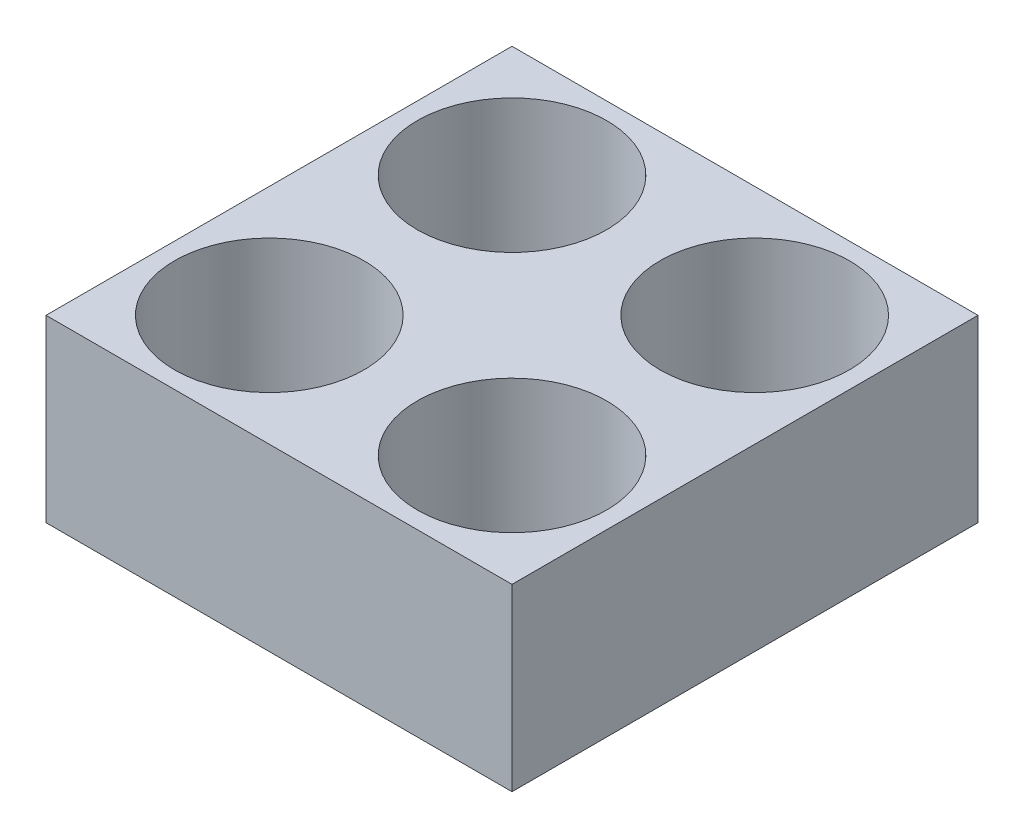
ISO-10303-21;
HEADER;
FILE_DESCRIPTION(('STEP AP214'),'2;1');
FILE_NAME('part.step','',(''),(''),'','','');
FILE_SCHEMA(('AUTOMOTIVE_DESIGN { 1 0 10303 214 1 1 1 1 }'));
ENDSEC;
DATA;
#1=APPLICATION_CONTEXT('core data for automotive mechanical design processes');
#2=APPLICATION_PROTOCOL_DEFINITION('international standard','automotive_design',2000,#1);
#3=PRODUCT_CONTEXT('',#1,'mechanical');
#4=PRODUCT('Part','Part','',(#3));
#5=PRODUCT_RELATED_PRODUCT_CATEGORY('part','',(#4));
#6=PRODUCT_DEFINITION_FORMATION('','',#4);
#7=PRODUCT_DEFINITION_CONTEXT('part definition',#1,'design');
#8=PRODUCT_DEFINITION('design','',#6,#7);
#9=PRODUCT_DEFINITION_SHAPE('','',#8);
#10=(LENGTH_UNIT() NAMED_UNIT(*) SI_UNIT(.MILLI.,.METRE.));
#11=(NAMED_UNIT(*) PLANE_ANGLE_UNIT() SI_UNIT($,.RADIAN.));
#12=(NAMED_UNIT(*) SI_UNIT($,.STERADIAN.) SOLID_ANGLE_UNIT());
#13=UNCERTAINTY_MEASURE_WITH_UNIT(LENGTH_MEASURE(1.E-05),#10,'distance_accuracy_value','');
#14=(GEOMETRIC_REPRESENTATION_CONTEXT(3) GLOBAL_UNCERTAINTY_ASSIGNED_CONTEXT((#13)) GLOBAL_UNIT_ASSIGNED_CONTEXT((#10,
#11,#12)) REPRESENTATION_CONTEXT('',''));
#15=CARTESIAN_POINT('',(0.,0.,0.));
#16=DIRECTION('',(0.,0.,1.));
#17=DIRECTION('',(1.,0.,0.));
#18=AXIS2_PLACEMENT_3D('',#15,#16,#17);
#19=CARTESIAN_POINT('',(0.,35.,0.));
#20=DIRECTION('',(0.,-1.,0.));
#21=DIRECTION('',(0.,0.,-1.));
#22=AXIS2_PLACEMENT_3D('',#19,#20,#21);
#23=PLANE('',#22);
#24=DIRECTION('',(0.,0.,-1.));
#25=VECTOR('',#24,1.);
#26=CARTESIAN_POINT('',(72.9999999999998,35.,23.));
#27=LINE('',#26,#25);
#28=CARTESIAN_POINT('',(72.9999999999998,35.,23.));
#29=VERTEX_POINT('',#28);
#30=CARTESIAN_POINT('',(72.9999999999998,35.,-73.));
#31=VERTEX_POINT('',#30);
#32=EDGE_CURVE('E124',#29,#31,#27,.T.);
#33=ORIENTED_EDGE('',*,*,#32,.T.);
#34=DIRECTION('',(-1.,0.,0.));
#35=VECTOR('',#34,1.);
#36=CARTESIAN_POINT('',(-23.0000000000002,35.,-73.));
#37=LINE('',#36,#35);
#38=CARTESIAN_POINT('',(-23.0000000000002,35.,-73.));
#39=VERTEX_POINT('',#38);
#40=EDGE_CURVE('E78',#31,#39,#37,.T.);
#41=ORIENTED_EDGE('',*,*,#40,.T.);
#42=DIRECTION('',(0.,0.,1.));
#43=VECTOR('',#42,1.);
#44=CARTESIAN_POINT('',(-23.0000000000002,35.,23.));
#45=LINE('',#44,#43);
#46=CARTESIAN_POINT('',(-23.0000000000002,35.,23.));
#47=VERTEX_POINT('',#46);
#48=EDGE_CURVE('E53',#39,#47,#45,.T.);
#49=ORIENTED_EDGE('',*,*,#48,.T.);
#50=DIRECTION('',(1.,0.,0.));
#51=VECTOR('',#50,1.);
#52=CARTESIAN_POINT('',(-23.0000000000002,35.,23.));
#53=LINE('',#52,#51);
#54=EDGE_CURVE('E48',#47,#29,#53,.T.);
#55=ORIENTED_EDGE('',*,*,#54,.T.);
#56=EDGE_LOOP('',(#33,#41,#49,#55));
#57=FACE_BOUND('',#56,.T.);
#58=CARTESIAN_POINT('',(0.,35.,0.));
#59=DIRECTION('',(0.,1.,0.));
#60=DIRECTION('',(0.,0.,1.));
#61=AXIS2_PLACEMENT_3D('',#58,#59,#60);
#62=CIRCLE('',#61,19.5);
#63=CARTESIAN_POINT('',(0.,35.,19.5));
#64=VERTEX_POINT('',#63);
#65=EDGE_CURVE('E121',#64,#64,#62,.T.);
#66=ORIENTED_EDGE('',*,*,#65,.F.);
#67=EDGE_LOOP('',(#66));
#68=FACE_BOUND('',#67,.T.);
#69=CARTESIAN_POINT('',(50.,35.,0.));
#70=DIRECTION('',(0.,1.,0.));
#71=DIRECTION('',(0.,0.,1.));
#72=AXIS2_PLACEMENT_3D('',#69,#70,#71);
#73=CIRCLE('',#72,19.5);
#74=CARTESIAN_POINT('',(50.,35.,19.5));
#75=VERTEX_POINT('',#74);
#76=EDGE_CURVE('E115',#75,#75,#73,.T.);
#77=ORIENTED_EDGE('',*,*,#76,.F.);
#78=EDGE_LOOP('',(#77));
#79=FACE_BOUND('',#78,.T.);
#80=CARTESIAN_POINT('',(49.9999999999998,35.,-50.));
#81=DIRECTION('',(0.,1.,0.));
#82=DIRECTION('',(0.,0.,1.));
#83=AXIS2_PLACEMENT_3D('',#80,#81,#82);
#84=CIRCLE('',#83,19.5);
#85=CARTESIAN_POINT('',(49.9999999999998,35.,-30.5));
#86=VERTEX_POINT('',#85);
#87=EDGE_CURVE('E109',#86,#86,#84,.T.);
#88=ORIENTED_EDGE('',*,*,#87,.F.);
#89=EDGE_LOOP('',(#88));
#90=FACE_BOUND('',#89,.T.);
#91=CARTESIAN_POINT('',(-1.74574066942157E-13,35.,-50.));
#92=DIRECTION('',(0.,1.,0.));
#93=DIRECTION('',(0.,0.,1.));
#94=AXIS2_PLACEMENT_3D('',#91,#92,#93);
#95=CIRCLE('',#94,19.5);
#96=CARTESIAN_POINT('',(-1.74574066942157E-13,35.,-30.5));
#97=VERTEX_POINT('',#96);
#98=EDGE_CURVE('E103',#97,#97,#95,.T.);
#99=ORIENTED_EDGE('',*,*,#98,.F.);
#100=EDGE_LOOP('',(#99));
#101=FACE_BOUND('',#100,.T.);
#102=ADVANCED_FACE('F33',(#57,#68,#79,#90,#101),#23,.F.);
#103=CARTESIAN_POINT('',(72.9999999999998,35.,23.));
#104=DIRECTION('',(-1.,0.,0.));
#105=DIRECTION('',(0.,0.,1.));
#106=AXIS2_PLACEMENT_3D('',#103,#104,#105);
#107=PLANE('',#106);
#108=DIRECTION('',(0.,-1.,0.));
#109=VECTOR('',#108,1.);
#110=CARTESIAN_POINT('',(72.9999999999998,35.,23.));
#111=LINE('',#110,#109);
#112=CARTESIAN_POINT('',(72.9999999999998,-2.,23.));
#113=VERTEX_POINT('',#112);
#114=EDGE_CURVE('E83',#29,#113,#111,.T.);
#115=ORIENTED_EDGE('',*,*,#114,.T.);
#116=DIRECTION('',(0.,0.,1.));
#117=VECTOR('',#116,1.);
#118=CARTESIAN_POINT('',(72.9999999999998,-2.,-73.));
#119=LINE('',#118,#117);
#120=CARTESIAN_POINT('',(72.9999999999998,-2.,-73.));
#121=VERTEX_POINT('',#120);
#122=EDGE_CURVE('E82',#121,#113,#119,.T.);
#123=ORIENTED_EDGE('',*,*,#122,.F.);
#124=DIRECTION('',(0.,-1.,0.));
#125=VECTOR('',#124,1.);
#126=CARTESIAN_POINT('',(72.9999999999998,35.,-73.));
#127=LINE('',#126,#125);
#128=EDGE_CURVE('E11',#31,#121,#127,.T.);
#129=ORIENTED_EDGE('',*,*,#128,.F.);
#130=ORIENTED_EDGE('',*,*,#32,.F.);
#131=EDGE_LOOP('',(#115,#123,#129,#130));
#132=FACE_BOUND('',#131,.T.);
#133=ADVANCED_FACE('F35',(#132),#107,.F.);
#134=CARTESIAN_POINT('',(-23.0000000000002,35.,-73.));
#135=DIRECTION('',(0.,0.,1.));
#136=DIRECTION('',(1.,0.,0.));
#137=AXIS2_PLACEMENT_3D('',#134,#135,#136);
#138=PLANE('',#137);
#139=ORIENTED_EDGE('',*,*,#128,.T.);
#140=DIRECTION('',(1.,0.,0.));
#141=VECTOR('',#140,1.);
#142=CARTESIAN_POINT('',(-23.0000000000002,-2.,-73.));
#143=LINE('',#142,#141);
#144=CARTESIAN_POINT('',(-23.0000000000002,-2.,-73.));
#145=VERTEX_POINT('',#144);
#146=EDGE_CURVE('E77',#145,#121,#143,.T.);
#147=ORIENTED_EDGE('',*,*,#146,.F.);
#148=DIRECTION('',(0.,-1.,0.));
#149=VECTOR('',#148,1.);
#150=CARTESIAN_POINT('',(-23.0000000000002,35.,-73.));
#151=LINE('',#150,#149);
#152=EDGE_CURVE('E41',#39,#145,#151,.T.);
#153=ORIENTED_EDGE('',*,*,#152,.F.);
#154=ORIENTED_EDGE('',*,*,#40,.F.);
#155=EDGE_LOOP('',(#139,#147,#153,#154));
#156=FACE_BOUND('',#155,.T.);
#157=ADVANCED_FACE('F74',(#156),#138,.F.);
#158=CARTESIAN_POINT('',(-23.0000000000002,35.,23.));
#159=DIRECTION('',(1.,0.,0.));
#160=DIRECTION('',(0.,0.,-1.));
#161=AXIS2_PLACEMENT_3D('',#158,#159,#160);
#162=PLANE('',#161);
#163=ORIENTED_EDGE('',*,*,#152,.T.);
#164=DIRECTION('',(0.,0.,-1.));
#165=VECTOR('',#164,1.);
#166=CARTESIAN_POINT('',(-23.0000000000002,-2.,23.));
#167=LINE('',#166,#165);
#168=CARTESIAN_POINT('',(-23.0000000000002,-2.,23.));
#169=VERTEX_POINT('',#168);
#170=EDGE_CURVE('E92',#169,#145,#167,.T.);
#171=ORIENTED_EDGE('',*,*,#170,.F.);
#172=DIRECTION('',(0.,-1.,0.));
#173=VECTOR('',#172,1.);
#174=CARTESIAN_POINT('',(-23.0000000000002,35.,23.));
#175=LINE('',#174,#173);
#176=EDGE_CURVE('E132',#47,#169,#175,.T.);
#177=ORIENTED_EDGE('',*,*,#176,.F.);
#178=ORIENTED_EDGE('',*,*,#48,.F.);
#179=EDGE_LOOP('',(#163,#171,#177,#178));
#180=FACE_BOUND('',#179,.T.);
#181=ADVANCED_FACE('F134',(#180),#162,.F.);
#182=CARTESIAN_POINT('',(-23.0000000000002,35.,23.));
#183=DIRECTION('',(0.,0.,-1.));
#184=DIRECTION('',(-1.,0.,0.));
#185=AXIS2_PLACEMENT_3D('',#182,#183,#184);
#186=PLANE('',#185);
#187=ORIENTED_EDGE('',*,*,#176,.T.);
#188=DIRECTION('',(-1.,0.,0.));
#189=VECTOR('',#188,1.);
#190=CARTESIAN_POINT('',(72.9999999999998,-2.,23.));
#191=LINE('',#190,#189);
#192=EDGE_CURVE('E87',#113,#169,#191,.T.);
#193=ORIENTED_EDGE('',*,*,#192,.F.);
#194=ORIENTED_EDGE('',*,*,#114,.F.);
#195=ORIENTED_EDGE('',*,*,#54,.F.);
#196=EDGE_LOOP('',(#187,#193,#194,#195));
#197=FACE_BOUND('',#196,.T.);
#198=ADVANCED_FACE('F136',(#197),#186,.F.);
#199=CARTESIAN_POINT('',(0.,35.,0.));
#200=DIRECTION('',(0.,-1.,0.));
#201=DIRECTION('',(0.,0.,-1.));
#202=AXIS2_PLACEMENT_3D('',#199,#200,#201);
#203=CYLINDRICAL_SURFACE('',#202,19.5);
#204=ORIENTED_EDGE('',*,*,#65,.T.);
#205=EDGE_LOOP('',(#204));
#206=FACE_BOUND('',#205,.T.);
#207=CARTESIAN_POINT('',(0.,0.,0.));
#208=DIRECTION('',(0.,1.,0.));
#209=DIRECTION('',(0.,0.,1.));
#210=AXIS2_PLACEMENT_3D('',#207,#208,#209);
#211=CIRCLE('',#210,19.5);
#212=CARTESIAN_POINT('',(0.,0.,19.5));
#213=VERTEX_POINT('',#212);
#214=EDGE_CURVE('E118',#213,#213,#211,.T.);
#215=ORIENTED_EDGE('',*,*,#214,.F.);
#216=EDGE_LOOP('',(#215));
#217=FACE_BOUND('',#216,.T.);
#218=ADVANCED_FACE('F196',(#206,#217),#203,.F.);
#219=CARTESIAN_POINT('',(50.,35.,0.));
#220=DIRECTION('',(0.,-1.,0.));
#221=DIRECTION('',(0.,0.,-1.));
#222=AXIS2_PLACEMENT_3D('',#219,#220,#221);
#223=CYLINDRICAL_SURFACE('',#222,19.5);
#224=ORIENTED_EDGE('',*,*,#76,.T.);
#225=EDGE_LOOP('',(#224));
#226=FACE_BOUND('',#225,.T.);
#227=CARTESIAN_POINT('',(50.,0.,0.));
#228=DIRECTION('',(0.,1.,0.));
#229=DIRECTION('',(0.,0.,1.));
#230=AXIS2_PLACEMENT_3D('',#227,#228,#229);
#231=CIRCLE('',#230,19.5);
#232=CARTESIAN_POINT('',(50.,0.,19.5));
#233=VERTEX_POINT('',#232);
#234=EDGE_CURVE('E112',#233,#233,#231,.T.);
#235=ORIENTED_EDGE('',*,*,#234,.F.);
#236=EDGE_LOOP('',(#235));
#237=FACE_BOUND('',#236,.T.);
#238=ADVANCED_FACE('F198',(#226,#237),#223,.F.);
#239=CARTESIAN_POINT('',(49.9999999999998,35.,-50.));
#240=DIRECTION('',(0.,-1.,0.));
#241=DIRECTION('',(0.,0.,-1.));
#242=AXIS2_PLACEMENT_3D('',#239,#240,#241);
#243=CYLINDRICAL_SURFACE('',#242,19.5);
#244=ORIENTED_EDGE('',*,*,#87,.T.);
#245=EDGE_LOOP('',(#244));
#246=FACE_BOUND('',#245,.T.);
#247=CARTESIAN_POINT('',(49.9999999999998,0.,-50.));
#248=DIRECTION('',(0.,1.,0.));
#249=DIRECTION('',(0.,0.,1.));
#250=AXIS2_PLACEMENT_3D('',#247,#248,#249);
#251=CIRCLE('',#250,19.5);
#252=CARTESIAN_POINT('',(49.9999999999998,0.,-30.5));
#253=VERTEX_POINT('',#252);
#254=EDGE_CURVE('E106',#253,#253,#251,.T.);
#255=ORIENTED_EDGE('',*,*,#254,.F.);
#256=EDGE_LOOP('',(#255));
#257=FACE_BOUND('',#256,.T.);
#258=ADVANCED_FACE('F152',(#246,#257),#243,.F.);
#259=CARTESIAN_POINT('',(-1.74574066942157E-13,35.,-50.));
#260=DIRECTION('',(0.,-1.,0.));
#261=DIRECTION('',(0.,0.,-1.));
#262=AXIS2_PLACEMENT_3D('',#259,#260,#261);
#263=CYLINDRICAL_SURFACE('',#262,19.5);
#264=ORIENTED_EDGE('',*,*,#98,.T.);
#265=EDGE_LOOP('',(#264));
#266=FACE_BOUND('',#265,.T.);
#267=CARTESIAN_POINT('',(-1.74574066942157E-13,0.,-50.));
#268=DIRECTION('',(0.,1.,0.));
#269=DIRECTION('',(0.,0.,1.));
#270=AXIS2_PLACEMENT_3D('',#267,#268,#269);
#271=CIRCLE('',#270,19.5);
#272=CARTESIAN_POINT('',(-1.74574066942157E-13,0.,-30.5));
#273=VERTEX_POINT('',#272);
#274=EDGE_CURVE('E102',#273,#273,#271,.T.);
#275=ORIENTED_EDGE('',*,*,#274,.F.);
#276=EDGE_LOOP('',(#275));
#277=FACE_BOUND('',#276,.T.);
#278=ADVANCED_FACE('F148',(#266,#277),#263,.F.);
#279=CARTESIAN_POINT('',(0.,0.,0.));
#280=DIRECTION('',(0.,-1.,0.));
#281=DIRECTION('',(0.,0.,-1.));
#282=AXIS2_PLACEMENT_3D('',#279,#280,#281);
#283=PLANE('',#282);
#284=CARTESIAN_POINT('',(7.,0.,-57.));
#285=DIRECTION('',(0.,1.,0.));
#286=DIRECTION('',(0.,0.,1.));
#287=AXIS2_PLACEMENT_3D('',#284,#285,#286);
#288=CIRCLE('',#287,3.6);
#289=CARTESIAN_POINT('',(7.,0.,-53.4));
#290=VERTEX_POINT('',#289);
#291=EDGE_CURVE('E525',#290,#290,#288,.T.);
#292=ORIENTED_EDGE('',*,*,#291,.F.);
#293=EDGE_LOOP('',(#292));
#294=FACE_BOUND('',#293,.T.);
#295=CARTESIAN_POINT('',(7.,0.,-43.));
#296=DIRECTION('',(0.,1.,0.));
#297=DIRECTION('',(0.,0.,-1.));
#298=AXIS2_PLACEMENT_3D('',#295,#296,#297);
#299=CIRCLE('',#298,3.6);
#300=CARTESIAN_POINT('',(7.,0.,-46.6));
#301=VERTEX_POINT('',#300);
#302=EDGE_CURVE('E531',#301,#301,#299,.T.);
#303=ORIENTED_EDGE('',*,*,#302,.F.);
#304=EDGE_LOOP('',(#303));
#305=FACE_BOUND('',#304,.T.);
#306=CARTESIAN_POINT('',(-7.,0.,-43.));
#307=DIRECTION('',(0.,1.,0.));
#308=DIRECTION('',(0.,0.,1.));
#309=AXIS2_PLACEMENT_3D('',#306,#307,#308);
#310=CIRCLE('',#309,3.6);
#311=CARTESIAN_POINT('',(-7.,0.,-39.4));
#312=VERTEX_POINT('',#311);
#313=EDGE_CURVE('E537',#312,#312,#310,.T.);
#314=ORIENTED_EDGE('',*,*,#313,.F.);
#315=EDGE_LOOP('',(#314));
#316=FACE_BOUND('',#315,.T.);
#317=CARTESIAN_POINT('',(-7.,0.,-57.));
#318=DIRECTION('',(0.,1.,0.));
#319=DIRECTION('',(0.,0.,-1.));
#320=AXIS2_PLACEMENT_3D('',#317,#318,#319);
#321=CIRCLE('',#320,3.6);
#322=CARTESIAN_POINT('',(-7.,0.,-60.6));
#323=VERTEX_POINT('',#322);
#324=EDGE_CURVE('E543',#323,#323,#321,.T.);
#325=ORIENTED_EDGE('',*,*,#324,.F.);
#326=EDGE_LOOP('',(#325));
#327=FACE_BOUND('',#326,.T.);
#328=ORIENTED_EDGE('',*,*,#274,.T.);
#329=EDGE_LOOP('',(#328));
#330=FACE_BOUND('',#329,.T.);
#331=ADVANCED_FACE('F151',(#294,#305,#316,#327,#330),#283,.F.);
#332=CARTESIAN_POINT('',(56.9999999999998,0.,-57.));
#333=DIRECTION('',(0.,1.,0.));
#334=DIRECTION('',(0.,0.,-1.));
#335=AXIS2_PLACEMENT_3D('',#332,#333,#334);
#336=CIRCLE('',#335,3.6);
#337=CARTESIAN_POINT('',(56.9999999999998,0.,-60.6));
#338=VERTEX_POINT('',#337);
#339=EDGE_CURVE('E466',#338,#338,#336,.T.);
#340=ORIENTED_EDGE('',*,*,#339,.F.);
#341=EDGE_LOOP('',(#340));
#342=FACE_BOUND('',#341,.T.);
#343=CARTESIAN_POINT('',(42.9999999999998,0.,-43.));
#344=DIRECTION('',(0.,1.,0.));
#345=DIRECTION('',(0.,0.,-1.));
#346=AXIS2_PLACEMENT_3D('',#343,#344,#345);
#347=CIRCLE('',#346,3.6);
#348=CARTESIAN_POINT('',(42.9999999999998,0.,-46.6));
#349=VERTEX_POINT('',#348);
#350=EDGE_CURVE('E471',#349,#349,#347,.T.);
#351=ORIENTED_EDGE('',*,*,#350,.F.);
#352=EDGE_LOOP('',(#351));
#353=FACE_BOUND('',#352,.T.);
#354=CARTESIAN_POINT('',(42.9999999999998,0.,-57.));
#355=DIRECTION('',(0.,1.,0.));
#356=DIRECTION('',(0.,0.,1.));
#357=AXIS2_PLACEMENT_3D('',#354,#355,#356);
#358=CIRCLE('',#357,3.6);
#359=CARTESIAN_POINT('',(42.9999999999998,0.,-53.4));
#360=VERTEX_POINT('',#359);
#361=EDGE_CURVE('E479',#360,#360,#358,.T.);
#362=ORIENTED_EDGE('',*,*,#361,.F.);
#363=EDGE_LOOP('',(#362));
#364=FACE_BOUND('',#363,.T.);
#365=CARTESIAN_POINT('',(56.9999999999998,0.,-43.));
#366=DIRECTION('',(0.,1.,0.));
#367=DIRECTION('',(0.,0.,1.));
#368=AXIS2_PLACEMENT_3D('',#365,#366,#367);
#369=CIRCLE('',#368,3.6);
#370=CARTESIAN_POINT('',(56.9999999999998,0.,-39.4));
#371=VERTEX_POINT('',#370);
#372=EDGE_CURVE('E96',#371,#371,#369,.T.);
#373=ORIENTED_EDGE('',*,*,#372,.F.);
#374=EDGE_LOOP('',(#373));
#375=FACE_BOUND('',#374,.T.);
#376=ORIENTED_EDGE('',*,*,#254,.T.);
#377=EDGE_LOOP('',(#376));
#378=FACE_BOUND('',#377,.T.);
#379=ADVANCED_FACE('F157',(#342,#353,#364,#375,#378),#283,.F.);
#380=CARTESIAN_POINT('',(57.,0.,-7.));
#381=DIRECTION('',(0.,1.,0.));
#382=DIRECTION('',(0.,0.,1.));
#383=AXIS2_PLACEMENT_3D('',#380,#381,#382);
#384=CIRCLE('',#383,3.6);
#385=CARTESIAN_POINT('',(57.,0.,-3.4));
#386=VERTEX_POINT('',#385);
#387=EDGE_CURVE('E485',#386,#386,#384,.T.);
#388=ORIENTED_EDGE('',*,*,#387,.F.);
#389=EDGE_LOOP('',(#388));
#390=FACE_BOUND('',#389,.T.);
#391=CARTESIAN_POINT('',(43.,0.,-7.));
#392=DIRECTION('',(0.,1.,0.));
#393=DIRECTION('',(0.,0.,-1.));
#394=AXIS2_PLACEMENT_3D('',#391,#392,#393);
#395=CIRCLE('',#394,3.6);
#396=CARTESIAN_POINT('',(43.,0.,-10.6));
#397=VERTEX_POINT('',#396);
#398=EDGE_CURVE('E491',#397,#397,#395,.T.);
#399=ORIENTED_EDGE('',*,*,#398,.F.);
#400=EDGE_LOOP('',(#399));
#401=FACE_BOUND('',#400,.T.);
#402=CARTESIAN_POINT('',(43.,0.,7.));
#403=DIRECTION('',(0.,1.,0.));
#404=DIRECTION('',(0.,0.,1.));
#405=AXIS2_PLACEMENT_3D('',#402,#403,#404);
#406=CIRCLE('',#405,3.6);
#407=CARTESIAN_POINT('',(43.,0.,10.6));
#408=VERTEX_POINT('',#407);
#409=EDGE_CURVE('E497',#408,#408,#406,.T.);
#410=ORIENTED_EDGE('',*,*,#409,.F.);
#411=EDGE_LOOP('',(#410));
#412=FACE_BOUND('',#411,.T.);
#413=CARTESIAN_POINT('',(57.,0.,7.));
#414=DIRECTION('',(0.,1.,0.));
#415=DIRECTION('',(0.,0.,-1.));
#416=AXIS2_PLACEMENT_3D('',#413,#414,#415);
#417=CIRCLE('',#416,3.6);
#418=CARTESIAN_POINT('',(57.,0.,3.4));
#419=VERTEX_POINT('',#418);
#420=EDGE_CURVE('E503',#419,#419,#417,.T.);
#421=ORIENTED_EDGE('',*,*,#420,.F.);
#422=EDGE_LOOP('',(#421));
#423=FACE_BOUND('',#422,.T.);
#424=ORIENTED_EDGE('',*,*,#234,.T.);
#425=EDGE_LOOP('',(#424));
#426=FACE_BOUND('',#425,.T.);
#427=ADVANCED_FACE('F164',(#390,#401,#412,#423,#426),#283,.F.);
#428=CARTESIAN_POINT('',(7.,0.,-7.));
#429=DIRECTION('',(0.,1.,0.));
#430=DIRECTION('',(0.,0.,1.));
#431=AXIS2_PLACEMENT_3D('',#428,#429,#430);
#432=CIRCLE('',#431,3.6);
#433=CARTESIAN_POINT('',(7.,0.,-3.4));
#434=VERTEX_POINT('',#433);
#435=EDGE_CURVE('E181',#434,#434,#432,.T.);
#436=ORIENTED_EDGE('',*,*,#435,.F.);
#437=EDGE_LOOP('',(#436));
#438=FACE_BOUND('',#437,.T.);
#439=CARTESIAN_POINT('',(7.,0.,7.));
#440=DIRECTION('',(0.,1.,0.));
#441=DIRECTION('',(0.,0.,-1.));
#442=AXIS2_PLACEMENT_3D('',#439,#440,#441);
#443=CIRCLE('',#442,3.6);
#444=CARTESIAN_POINT('',(7.,0.,3.4));
#445=VERTEX_POINT('',#444);
#446=EDGE_CURVE('E185',#445,#445,#443,.T.);
#447=ORIENTED_EDGE('',*,*,#446,.F.);
#448=EDGE_LOOP('',(#447));
#449=FACE_BOUND('',#448,.T.);
#450=CARTESIAN_POINT('',(-7.,0.,7.));
#451=DIRECTION('',(0.,1.,0.));
#452=DIRECTION('',(0.,0.,1.));
#453=AXIS2_PLACEMENT_3D('',#450,#451,#452);
#454=CIRCLE('',#453,3.6);
#455=CARTESIAN_POINT('',(-7.,0.,10.6));
#456=VERTEX_POINT('',#455);
#457=EDGE_CURVE('E189',#456,#456,#454,.T.);
#458=ORIENTED_EDGE('',*,*,#457,.F.);
#459=EDGE_LOOP('',(#458));
#460=FACE_BOUND('',#459,.T.);
#461=CARTESIAN_POINT('',(-7.,0.,-6.99999999999999));
#462=DIRECTION('',(0.,1.,0.));
#463=DIRECTION('',(0.,0.,-1.));
#464=AXIS2_PLACEMENT_3D('',#461,#462,#463);
#465=CIRCLE('',#464,3.6);
#466=CARTESIAN_POINT('',(-7.,0.,-10.6));
#467=VERTEX_POINT('',#466);
#468=EDGE_CURVE('E193',#467,#467,#465,.T.);
#469=ORIENTED_EDGE('',*,*,#468,.F.);
#470=EDGE_LOOP('',(#469));
#471=FACE_BOUND('',#470,.T.);
#472=ORIENTED_EDGE('',*,*,#214,.T.);
#473=EDGE_LOOP('',(#472));
#474=FACE_BOUND('',#473,.T.);
#475=ADVANCED_FACE('F160',(#438,#449,#460,#471,#474),#283,.F.);
#476=CARTESIAN_POINT('',(0.,-2.,0.));
#477=DIRECTION('',(0.,-1.,0.));
#478=DIRECTION('',(0.,0.,-1.));
#479=AXIS2_PLACEMENT_3D('',#476,#477,#478);
#480=PLANE('',#479);
#481=CARTESIAN_POINT('',(56.9999999999998,-2.,-57.));
#482=DIRECTION('',(0.,1.,0.));
#483=DIRECTION('',(0.,0.,-1.));
#484=AXIS2_PLACEMENT_3D('',#481,#482,#483);
#485=CIRCLE('',#484,3.6);
#486=CARTESIAN_POINT('',(56.9999999999998,-2.,-60.6));
#487=VERTEX_POINT('',#486);
#488=EDGE_CURVE('E463',#487,#487,#485,.T.);
#489=ORIENTED_EDGE('',*,*,#488,.T.);
#490=EDGE_LOOP('',(#489));
#491=FACE_BOUND('',#490,.T.);
#492=CARTESIAN_POINT('',(42.9999999999998,-2.,-43.));
#493=DIRECTION('',(0.,1.,0.));
#494=DIRECTION('',(0.,0.,-1.));
#495=AXIS2_PLACEMENT_3D('',#492,#493,#494);
#496=CIRCLE('',#495,3.6);
#497=CARTESIAN_POINT('',(42.9999999999998,-2.,-46.6));
#498=VERTEX_POINT('',#497);
#499=EDGE_CURVE('E467',#498,#498,#496,.T.);
#500=ORIENTED_EDGE('',*,*,#499,.T.);
#501=EDGE_LOOP('',(#500));
#502=FACE_BOUND('',#501,.T.);
#503=CARTESIAN_POINT('',(42.9999999999998,-2.,-57.));
#504=DIRECTION('',(0.,1.,0.));
#505=DIRECTION('',(0.,0.,1.));
#506=AXIS2_PLACEMENT_3D('',#503,#504,#505);
#507=CIRCLE('',#506,3.6);
#508=CARTESIAN_POINT('',(42.9999999999998,-2.,-53.4));
#509=VERTEX_POINT('',#508);
#510=EDGE_CURVE('E476',#509,#509,#507,.T.);
#511=ORIENTED_EDGE('',*,*,#510,.T.);
#512=EDGE_LOOP('',(#511));
#513=FACE_BOUND('',#512,.T.);
#514=CARTESIAN_POINT('',(57.,-2.,-7.));
#515=DIRECTION('',(0.,1.,0.));
#516=DIRECTION('',(0.,0.,1.));
#517=AXIS2_PLACEMENT_3D('',#514,#515,#516);
#518=CIRCLE('',#517,3.6);
#519=CARTESIAN_POINT('',(57.,-2.,-3.4));
#520=VERTEX_POINT('',#519);
#521=EDGE_CURVE('E482',#520,#520,#518,.T.);
#522=ORIENTED_EDGE('',*,*,#521,.T.);
#523=EDGE_LOOP('',(#522));
#524=FACE_BOUND('',#523,.T.);
#525=CARTESIAN_POINT('',(43.,-2.,-7.));
#526=DIRECTION('',(0.,1.,0.));
#527=DIRECTION('',(0.,0.,-1.));
#528=AXIS2_PLACEMENT_3D('',#525,#526,#527);
#529=CIRCLE('',#528,3.6);
#530=CARTESIAN_POINT('',(43.,-2.,-10.6));
#531=VERTEX_POINT('',#530);
#532=EDGE_CURVE('E488',#531,#531,#529,.T.);
#533=ORIENTED_EDGE('',*,*,#532,.T.);
#534=EDGE_LOOP('',(#533));
#535=FACE_BOUND('',#534,.T.);
#536=CARTESIAN_POINT('',(43.,-2.,7.));
#537=DIRECTION('',(0.,1.,0.));
#538=DIRECTION('',(0.,0.,1.));
#539=AXIS2_PLACEMENT_3D('',#536,#537,#538);
#540=CIRCLE('',#539,3.6);
#541=CARTESIAN_POINT('',(43.,-2.,10.6));
#542=VERTEX_POINT('',#541);
#543=EDGE_CURVE('E494',#542,#542,#540,.T.);
#544=ORIENTED_EDGE('',*,*,#543,.T.);
#545=EDGE_LOOP('',(#544));
#546=FACE_BOUND('',#545,.T.);
#547=CARTESIAN_POINT('',(57.,-2.,7.));
#548=DIRECTION('',(0.,1.,0.));
#549=DIRECTION('',(0.,0.,-1.));
#550=AXIS2_PLACEMENT_3D('',#547,#548,#549);
#551=CIRCLE('',#550,3.6);
#552=CARTESIAN_POINT('',(57.,-2.,3.4));
#553=VERTEX_POINT('',#552);
#554=EDGE_CURVE('E500',#553,#553,#551,.T.);
#555=ORIENTED_EDGE('',*,*,#554,.T.);
#556=EDGE_LOOP('',(#555));
#557=FACE_BOUND('',#556,.T.);
#558=CARTESIAN_POINT('',(7.,-2.,-7.));
#559=DIRECTION('',(0.,1.,0.));
#560=DIRECTION('',(0.,0.,1.));
#561=AXIS2_PLACEMENT_3D('',#558,#559,#560);
#562=CIRCLE('',#561,3.6);
#563=CARTESIAN_POINT('',(7.,-2.,-3.4));
#564=VERTEX_POINT('',#563);
#565=EDGE_CURVE('E506',#564,#564,#562,.T.);
#566=ORIENTED_EDGE('',*,*,#565,.T.);
#567=EDGE_LOOP('',(#566));
#568=FACE_BOUND('',#567,.T.);
#569=CARTESIAN_POINT('',(7.,-2.,7.));
#570=DIRECTION('',(0.,1.,0.));
#571=DIRECTION('',(0.,0.,-1.));
#572=AXIS2_PLACEMENT_3D('',#569,#570,#571);
#573=CIRCLE('',#572,3.6);
#574=CARTESIAN_POINT('',(7.,-2.,3.4));
#575=VERTEX_POINT('',#574);
#576=EDGE_CURVE('E510',#575,#575,#573,.T.);
#577=ORIENTED_EDGE('',*,*,#576,.T.);
#578=EDGE_LOOP('',(#577));
#579=FACE_BOUND('',#578,.T.);
#580=CARTESIAN_POINT('',(-7.,-2.,7.));
#581=DIRECTION('',(0.,1.,0.));
#582=DIRECTION('',(0.,0.,1.));
#583=AXIS2_PLACEMENT_3D('',#580,#581,#582);
#584=CIRCLE('',#583,3.6);
#585=CARTESIAN_POINT('',(-7.,-2.,10.6));
#586=VERTEX_POINT('',#585);
#587=EDGE_CURVE('E514',#586,#586,#584,.T.);
#588=ORIENTED_EDGE('',*,*,#587,.T.);
#589=EDGE_LOOP('',(#588));
#590=FACE_BOUND('',#589,.T.);
#591=CARTESIAN_POINT('',(-7.,-2.,-6.99999999999999));
#592=DIRECTION('',(0.,1.,0.));
#593=DIRECTION('',(0.,0.,-1.));
#594=AXIS2_PLACEMENT_3D('',#591,#592,#593);
#595=CIRCLE('',#594,3.6);
#596=CARTESIAN_POINT('',(-7.,-2.,-10.6));
#597=VERTEX_POINT('',#596);
#598=EDGE_CURVE('E518',#597,#597,#595,.T.);
#599=ORIENTED_EDGE('',*,*,#598,.T.);
#600=EDGE_LOOP('',(#599));
#601=FACE_BOUND('',#600,.T.);
#602=CARTESIAN_POINT('',(7.,-2.,-57.));
#603=DIRECTION('',(0.,1.,0.));
#604=DIRECTION('',(0.,0.,1.));
#605=AXIS2_PLACEMENT_3D('',#602,#603,#604);
#606=CIRCLE('',#605,3.6);
#607=CARTESIAN_POINT('',(7.,-2.,-53.4));
#608=VERTEX_POINT('',#607);
#609=EDGE_CURVE('E522',#608,#608,#606,.T.);
#610=ORIENTED_EDGE('',*,*,#609,.T.);
#611=EDGE_LOOP('',(#610));
#612=FACE_BOUND('',#611,.T.);
#613=CARTESIAN_POINT('',(7.,-2.,-43.));
#614=DIRECTION('',(0.,1.,0.));
#615=DIRECTION('',(0.,0.,-1.));
#616=AXIS2_PLACEMENT_3D('',#613,#614,#615);
#617=CIRCLE('',#616,3.6);
#618=CARTESIAN_POINT('',(7.,-2.,-46.6));
#619=VERTEX_POINT('',#618);
#620=EDGE_CURVE('E528',#619,#619,#617,.T.);
#621=ORIENTED_EDGE('',*,*,#620,.T.);
#622=EDGE_LOOP('',(#621));
#623=FACE_BOUND('',#622,.T.);
#624=CARTESIAN_POINT('',(-7.,-2.,-43.));
#625=DIRECTION('',(0.,1.,0.));
#626=DIRECTION('',(0.,0.,1.));
#627=AXIS2_PLACEMENT_3D('',#624,#625,#626);
#628=CIRCLE('',#627,3.6);
#629=CARTESIAN_POINT('',(-7.,-2.,-39.4));
#630=VERTEX_POINT('',#629);
#631=EDGE_CURVE('E534',#630,#630,#628,.T.);
#632=ORIENTED_EDGE('',*,*,#631,.T.);
#633=EDGE_LOOP('',(#632));
#634=FACE_BOUND('',#633,.T.);
#635=CARTESIAN_POINT('',(-7.,-2.,-57.));
#636=DIRECTION('',(0.,1.,0.));
#637=DIRECTION('',(0.,0.,-1.));
#638=AXIS2_PLACEMENT_3D('',#635,#636,#637);
#639=CIRCLE('',#638,3.6);
#640=CARTESIAN_POINT('',(-7.,-2.,-60.6));
#641=VERTEX_POINT('',#640);
#642=EDGE_CURVE('E540',#641,#641,#639,.T.);
#643=ORIENTED_EDGE('',*,*,#642,.T.);
#644=EDGE_LOOP('',(#643));
#645=FACE_BOUND('',#644,.T.);
#646=CARTESIAN_POINT('',(56.9999999999998,-2.,-43.));
#647=DIRECTION('',(0.,1.,0.));
#648=DIRECTION('',(0.,0.,1.));
#649=AXIS2_PLACEMENT_3D('',#646,#647,#648);
#650=CIRCLE('',#649,3.6);
#651=CARTESIAN_POINT('',(56.9999999999998,-2.,-39.4));
#652=VERTEX_POINT('',#651);
#653=EDGE_CURVE('E93',#652,#652,#650,.T.);
#654=ORIENTED_EDGE('',*,*,#653,.T.);
#655=EDGE_LOOP('',(#654));
#656=FACE_BOUND('',#655,.T.);
#657=ORIENTED_EDGE('',*,*,#146,.T.);
#658=ORIENTED_EDGE('',*,*,#122,.T.);
#659=ORIENTED_EDGE('',*,*,#192,.T.);
#660=ORIENTED_EDGE('',*,*,#170,.T.);
#661=EDGE_LOOP('',(#657,#658,#659,#660));
#662=FACE_BOUND('',#661,.T.);
#663=ADVANCED_FACE('F90',(#491,#502,#513,#524,#535,#546,#557,#568,#579,#590,#601,#612,#623,#634,
#645,#656,#662),#480,.T.);
#664=CARTESIAN_POINT('',(56.9999999999998,-2.,-43.));
#665=DIRECTION('',(0.,1.,0.));
#666=DIRECTION('',(0.,0.,1.));
#667=AXIS2_PLACEMENT_3D('',#664,#665,#666);
#668=CYLINDRICAL_SURFACE('',#667,3.6);
#669=ORIENTED_EDGE('',*,*,#653,.F.);
#670=EDGE_LOOP('',(#669));
#671=FACE_BOUND('',#670,.T.);
#672=ORIENTED_EDGE('',*,*,#372,.T.);
#673=EDGE_LOOP('',(#672));
#674=FACE_BOUND('',#673,.T.);
#675=ADVANCED_FACE('F175',(#671,#674),#668,.F.);
#676=CARTESIAN_POINT('',(-7.,-2.,-57.));
#677=DIRECTION('',(0.,1.,0.));
#678=DIRECTION('',(0.,0.,1.));
#679=AXIS2_PLACEMENT_3D('',#676,#677,#678);
#680=CYLINDRICAL_SURFACE('',#679,3.6);
#681=ORIENTED_EDGE('',*,*,#642,.F.);
#682=EDGE_LOOP('',(#681));
#683=FACE_BOUND('',#682,.T.);
#684=ORIENTED_EDGE('',*,*,#324,.T.);
#685=EDGE_LOOP('',(#684));
#686=FACE_BOUND('',#685,.T.);
#687=ADVANCED_FACE('F306',(#683,#686),#680,.F.);
#688=CARTESIAN_POINT('',(-7.,-2.,-43.));
#689=DIRECTION('',(0.,1.,0.));
#690=DIRECTION('',(0.,0.,1.));
#691=AXIS2_PLACEMENT_3D('',#688,#689,#690);
#692=CYLINDRICAL_SURFACE('',#691,3.6);
#693=ORIENTED_EDGE('',*,*,#631,.F.);
#694=EDGE_LOOP('',(#693));
#695=FACE_BOUND('',#694,.T.);
#696=ORIENTED_EDGE('',*,*,#313,.T.);
#697=EDGE_LOOP('',(#696));
#698=FACE_BOUND('',#697,.T.);
#699=ADVANCED_FACE('F315',(#695,#698),#692,.F.);
#700=CARTESIAN_POINT('',(7.,-2.,-43.));
#701=DIRECTION('',(0.,1.,0.));
#702=DIRECTION('',(0.,0.,1.));
#703=AXIS2_PLACEMENT_3D('',#700,#701,#702);
#704=CYLINDRICAL_SURFACE('',#703,3.6);
#705=ORIENTED_EDGE('',*,*,#620,.F.);
#706=EDGE_LOOP('',(#705));
#707=FACE_BOUND('',#706,.T.);
#708=ORIENTED_EDGE('',*,*,#302,.T.);
#709=EDGE_LOOP('',(#708));
#710=FACE_BOUND('',#709,.T.);
#711=ADVANCED_FACE('F324',(#707,#710),#704,.F.);
#712=CARTESIAN_POINT('',(7.,-2.,-57.));
#713=DIRECTION('',(0.,1.,0.));
#714=DIRECTION('',(0.,0.,1.));
#715=AXIS2_PLACEMENT_3D('',#712,#713,#714);
#716=CYLINDRICAL_SURFACE('',#715,3.6);
#717=ORIENTED_EDGE('',*,*,#609,.F.);
#718=EDGE_LOOP('',(#717));
#719=FACE_BOUND('',#718,.T.);
#720=ORIENTED_EDGE('',*,*,#291,.T.);
#721=EDGE_LOOP('',(#720));
#722=FACE_BOUND('',#721,.T.);
#723=ADVANCED_FACE('F333',(#719,#722),#716,.F.);
#724=CARTESIAN_POINT('',(-7.,-2.,-6.99999999999999));
#725=DIRECTION('',(0.,1.,0.));
#726=DIRECTION('',(0.,0.,1.));
#727=AXIS2_PLACEMENT_3D('',#724,#725,#726);
#728=CYLINDRICAL_SURFACE('',#727,3.6);
#729=ORIENTED_EDGE('',*,*,#598,.F.);
#730=EDGE_LOOP('',(#729));
#731=FACE_BOUND('',#730,.T.);
#732=ORIENTED_EDGE('',*,*,#468,.T.);
#733=EDGE_LOOP('',(#732));
#734=FACE_BOUND('',#733,.T.);
#735=ADVANCED_FACE('F342',(#731,#734),#728,.F.);
#736=CARTESIAN_POINT('',(-7.,-2.,7.));
#737=DIRECTION('',(0.,1.,0.));
#738=DIRECTION('',(0.,0.,1.));
#739=AXIS2_PLACEMENT_3D('',#736,#737,#738);
#740=CYLINDRICAL_SURFACE('',#739,3.6);
#741=ORIENTED_EDGE('',*,*,#587,.F.);
#742=EDGE_LOOP('',(#741));
#743=FACE_BOUND('',#742,.T.);
#744=ORIENTED_EDGE('',*,*,#457,.T.);
#745=EDGE_LOOP('',(#744));
#746=FACE_BOUND('',#745,.T.);
#747=ADVANCED_FACE('F351',(#743,#746),#740,.F.);
#748=CARTESIAN_POINT('',(7.,-2.,7.));
#749=DIRECTION('',(0.,1.,0.));
#750=DIRECTION('',(0.,0.,1.));
#751=AXIS2_PLACEMENT_3D('',#748,#749,#750);
#752=CYLINDRICAL_SURFACE('',#751,3.6);
#753=ORIENTED_EDGE('',*,*,#576,.F.);
#754=EDGE_LOOP('',(#753));
#755=FACE_BOUND('',#754,.T.);
#756=ORIENTED_EDGE('',*,*,#446,.T.);
#757=EDGE_LOOP('',(#756));
#758=FACE_BOUND('',#757,.T.);
#759=ADVANCED_FACE('F360',(#755,#758),#752,.F.);
#760=CARTESIAN_POINT('',(7.,-2.,-7.));
#761=DIRECTION('',(0.,1.,0.));
#762=DIRECTION('',(0.,0.,1.));
#763=AXIS2_PLACEMENT_3D('',#760,#761,#762);
#764=CYLINDRICAL_SURFACE('',#763,3.6);
#765=ORIENTED_EDGE('',*,*,#565,.F.);
#766=EDGE_LOOP('',(#765));
#767=FACE_BOUND('',#766,.T.);
#768=ORIENTED_EDGE('',*,*,#435,.T.);
#769=EDGE_LOOP('',(#768));
#770=FACE_BOUND('',#769,.T.);
#771=ADVANCED_FACE('F369',(#767,#770),#764,.F.);
#772=CARTESIAN_POINT('',(57.,-2.,7.));
#773=DIRECTION('',(0.,1.,0.));
#774=DIRECTION('',(0.,0.,1.));
#775=AXIS2_PLACEMENT_3D('',#772,#773,#774);
#776=CYLINDRICAL_SURFACE('',#775,3.6);
#777=ORIENTED_EDGE('',*,*,#554,.F.);
#778=EDGE_LOOP('',(#777));
#779=FACE_BOUND('',#778,.T.);
#780=ORIENTED_EDGE('',*,*,#420,.T.);
#781=EDGE_LOOP('',(#780));
#782=FACE_BOUND('',#781,.T.);
#783=ADVANCED_FACE('F378',(#779,#782),#776,.F.);
#784=CARTESIAN_POINT('',(43.,-2.,7.));
#785=DIRECTION('',(0.,1.,0.));
#786=DIRECTION('',(0.,0.,1.));
#787=AXIS2_PLACEMENT_3D('',#784,#785,#786);
#788=CYLINDRICAL_SURFACE('',#787,3.6);
#789=ORIENTED_EDGE('',*,*,#543,.F.);
#790=EDGE_LOOP('',(#789));
#791=FACE_BOUND('',#790,.T.);
#792=ORIENTED_EDGE('',*,*,#409,.T.);
#793=EDGE_LOOP('',(#792));
#794=FACE_BOUND('',#793,.T.);
#795=ADVANCED_FACE('F387',(#791,#794),#788,.F.);
#796=CARTESIAN_POINT('',(43.,-2.,-7.));
#797=DIRECTION('',(0.,1.,0.));
#798=DIRECTION('',(0.,0.,1.));
#799=AXIS2_PLACEMENT_3D('',#796,#797,#798);
#800=CYLINDRICAL_SURFACE('',#799,3.6);
#801=ORIENTED_EDGE('',*,*,#532,.F.);
#802=EDGE_LOOP('',(#801));
#803=FACE_BOUND('',#802,.T.);
#804=ORIENTED_EDGE('',*,*,#398,.T.);
#805=EDGE_LOOP('',(#804));
#806=FACE_BOUND('',#805,.T.);
#807=ADVANCED_FACE('F396',(#803,#806),#800,.F.);
#808=CARTESIAN_POINT('',(57.,-2.,-7.));
#809=DIRECTION('',(0.,1.,0.));
#810=DIRECTION('',(0.,0.,1.));
#811=AXIS2_PLACEMENT_3D('',#808,#809,#810);
#812=CYLINDRICAL_SURFACE('',#811,3.6);
#813=ORIENTED_EDGE('',*,*,#521,.F.);
#814=EDGE_LOOP('',(#813));
#815=FACE_BOUND('',#814,.T.);
#816=ORIENTED_EDGE('',*,*,#387,.T.);
#817=EDGE_LOOP('',(#816));
#818=FACE_BOUND('',#817,.T.);
#819=ADVANCED_FACE('F405',(#815,#818),#812,.F.);
#820=CARTESIAN_POINT('',(42.9999999999998,-2.,-57.));
#821=DIRECTION('',(0.,1.,0.));
#822=DIRECTION('',(0.,0.,1.));
#823=AXIS2_PLACEMENT_3D('',#820,#821,#822);
#824=CYLINDRICAL_SURFACE('',#823,3.6);
#825=ORIENTED_EDGE('',*,*,#510,.F.);
#826=EDGE_LOOP('',(#825));
#827=FACE_BOUND('',#826,.T.);
#828=ORIENTED_EDGE('',*,*,#361,.T.);
#829=EDGE_LOOP('',(#828));
#830=FACE_BOUND('',#829,.T.);
#831=ADVANCED_FACE('F414',(#827,#830),#824,.F.);
#832=CARTESIAN_POINT('',(42.9999999999998,-2.,-43.));
#833=DIRECTION('',(0.,1.,0.));
#834=DIRECTION('',(0.,0.,1.));
#835=AXIS2_PLACEMENT_3D('',#832,#833,#834);
#836=CYLINDRICAL_SURFACE('',#835,3.6);
#837=ORIENTED_EDGE('',*,*,#499,.F.);
#838=EDGE_LOOP('',(#837));
#839=FACE_BOUND('',#838,.T.);
#840=ORIENTED_EDGE('',*,*,#350,.T.);
#841=EDGE_LOOP('',(#840));
#842=FACE_BOUND('',#841,.T.);
#843=ADVANCED_FACE('F423',(#839,#842),#836,.F.);
#844=CARTESIAN_POINT('',(56.9999999999998,-2.,-57.));
#845=DIRECTION('',(0.,1.,0.));
#846=DIRECTION('',(0.,0.,1.));
#847=AXIS2_PLACEMENT_3D('',#844,#845,#846);
#848=CYLINDRICAL_SURFACE('',#847,3.6);
#849=ORIENTED_EDGE('',*,*,#488,.F.);
#850=EDGE_LOOP('',(#849));
#851=FACE_BOUND('',#850,.T.);
#852=ORIENTED_EDGE('',*,*,#339,.T.);
#853=EDGE_LOOP('',(#852));
#854=FACE_BOUND('',#853,.T.);
#855=ADVANCED_FACE('F432',(#851,#854),#848,.F.);
#856=CLOSED_SHELL('',(#102,#133,#157,#181,#198,#218,#238,#258,#278,#331,#379,#427,#475,#663,
#675,#687,#699,#711,#723,#735,#747,#759,#771,#783,#795,#807,#819,#831,#843,#855));
#857=MANIFOLD_SOLID_BREP('B2',#856);
#858=ADVANCED_BREP_SHAPE_REPRESENTATION('',(#18,#857),#14);
#859=SHAPE_DEFINITION_REPRESENTATION(#9,#858);
ENDSEC;
END-ISO-10303-21;
